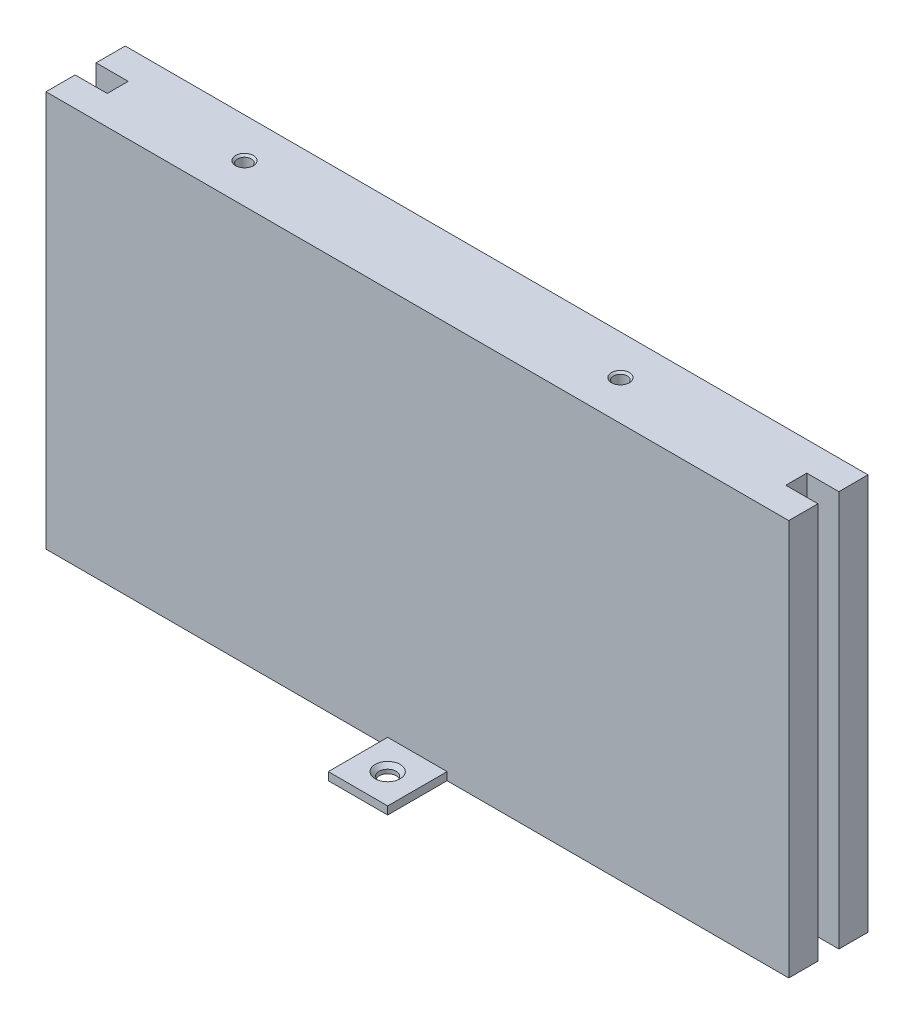
ISO-10303-21;
HEADER;
FILE_DESCRIPTION(('STEP AP214'),'2;1');
FILE_NAME('part.step','',(''),(''),'','','');
FILE_SCHEMA(('AUTOMOTIVE_DESIGN { 1 0 10303 214 1 1 1 1 }'));
ENDSEC;
DATA;
#1=APPLICATION_CONTEXT('core data for automotive mechanical design processes');
#2=APPLICATION_PROTOCOL_DEFINITION('international standard','automotive_design',2000,#1);
#3=PRODUCT_CONTEXT('',#1,'mechanical');
#4=PRODUCT('Part','Part','',(#3));
#5=PRODUCT_RELATED_PRODUCT_CATEGORY('part','',(#4));
#6=PRODUCT_DEFINITION_FORMATION('','',#4);
#7=PRODUCT_DEFINITION_CONTEXT('part definition',#1,'design');
#8=PRODUCT_DEFINITION('design','',#6,#7);
#9=PRODUCT_DEFINITION_SHAPE('','',#8);
#10=(LENGTH_UNIT() NAMED_UNIT(*) SI_UNIT(.MILLI.,.METRE.));
#11=(NAMED_UNIT(*) PLANE_ANGLE_UNIT() SI_UNIT($,.RADIAN.));
#12=(NAMED_UNIT(*) SI_UNIT($,.STERADIAN.) SOLID_ANGLE_UNIT());
#13=UNCERTAINTY_MEASURE_WITH_UNIT(LENGTH_MEASURE(1.E-05),#10,'distance_accuracy_value','');
#14=(GEOMETRIC_REPRESENTATION_CONTEXT(3) GLOBAL_UNCERTAINTY_ASSIGNED_CONTEXT((#13)) GLOBAL_UNIT_ASSIGNED_CONTEXT((#10,
#11,#12)) REPRESENTATION_CONTEXT('',''));
#15=CARTESIAN_POINT('',(0.,0.,0.));
#16=DIRECTION('',(0.,0.,1.));
#17=DIRECTION('',(1.,0.,0.));
#18=AXIS2_PLACEMENT_3D('',#15,#16,#17);
#19=CARTESIAN_POINT('',(187.5,100.,0.));
#20=DIRECTION('',(0.,0.,-1.));
#21=DIRECTION('',(-1.,0.,0.));
#22=AXIS2_PLACEMENT_3D('',#19,#20,#21);
#23=PLANE('',#22);
#24=DIRECTION('',(0.,-1.,0.));
#25=VECTOR('',#24,1.);
#26=CARTESIAN_POINT('',(86.25,0.,0.));
#27=LINE('',#26,#25);
#28=CARTESIAN_POINT('',(86.25,2.,0.));
#29=VERTEX_POINT('',#28);
#30=CARTESIAN_POINT('',(86.25,0.,0.));
#31=VERTEX_POINT('',#30);
#32=EDGE_CURVE('E64',#29,#31,#27,.T.);
#33=ORIENTED_EDGE('',*,*,#32,.F.);
#34=DIRECTION('',(-1.,0.,0.));
#35=VECTOR('',#34,1.);
#36=CARTESIAN_POINT('',(86.25,2.,0.));
#37=LINE('',#36,#35);
#38=CARTESIAN_POINT('',(101.25,2.,0.));
#39=VERTEX_POINT('',#38);
#40=EDGE_CURVE('E569',#39,#29,#37,.T.);
#41=ORIENTED_EDGE('',*,*,#40,.F.);
#42=DIRECTION('',(0.,1.,0.));
#43=VECTOR('',#42,1.);
#44=CARTESIAN_POINT('',(101.25,2.,0.));
#45=LINE('',#44,#43);
#46=CARTESIAN_POINT('',(101.25,0.,0.));
#47=VERTEX_POINT('',#46);
#48=EDGE_CURVE('E70',#47,#39,#45,.T.);
#49=ORIENTED_EDGE('',*,*,#48,.F.);
#50=DIRECTION('',(1.,0.,0.));
#51=VECTOR('',#50,1.);
#52=CARTESIAN_POINT('',(187.5,0.,0.));
#53=LINE('',#52,#51);
#54=CARTESIAN_POINT('',(187.5,0.,0.));
#55=VERTEX_POINT('',#54);
#56=EDGE_CURVE('E210',#47,#55,#53,.T.);
#57=ORIENTED_EDGE('',*,*,#56,.T.);
#58=DIRECTION('',(0.,-1.,0.));
#59=VECTOR('',#58,1.);
#60=CARTESIAN_POINT('',(187.5,100.,0.));
#61=LINE('',#60,#59);
#62=CARTESIAN_POINT('',(187.5,100.,0.));
#63=VERTEX_POINT('',#62);
#64=EDGE_CURVE('E384',#63,#55,#61,.T.);
#65=ORIENTED_EDGE('',*,*,#64,.F.);
#66=DIRECTION('',(1.,0.,0.));
#67=VECTOR('',#66,1.);
#68=CARTESIAN_POINT('',(187.5,100.,0.));
#69=LINE('',#68,#67);
#70=CARTESIAN_POINT('',(0.,100.,0.));
#71=VERTEX_POINT('',#70);
#72=EDGE_CURVE('E338',#71,#63,#69,.T.);
#73=ORIENTED_EDGE('',*,*,#72,.F.);
#74=DIRECTION('',(0.,-1.,0.));
#75=VECTOR('',#74,1.);
#76=CARTESIAN_POINT('',(0.,100.,0.));
#77=LINE('',#76,#75);
#78=CARTESIAN_POINT('',(0.,0.,0.));
#79=VERTEX_POINT('',#78);
#80=EDGE_CURVE('E356',#71,#79,#77,.T.);
#81=ORIENTED_EDGE('',*,*,#80,.T.);
#82=EDGE_CURVE('E357',#79,#31,#53,.T.);
#83=ORIENTED_EDGE('',*,*,#82,.T.);
#84=EDGE_LOOP('',(#33,#41,#49,#57,#65,#73,#81,#83));
#85=FACE_BOUND('',#84,.T.);
#86=ADVANCED_FACE('F47',(#85),#23,.F.);
#87=CARTESIAN_POINT('',(0.,100.,-20.));
#88=DIRECTION('',(0.,0.,1.));
#89=DIRECTION('',(1.,0.,0.));
#90=AXIS2_PLACEMENT_3D('',#87,#88,#89);
#91=PLANE('',#90);
#92=DIRECTION('',(0.,-1.,0.));
#93=VECTOR('',#92,1.);
#94=CARTESIAN_POINT('',(101.25,2.00000000000004,-20.));
#95=LINE('',#94,#93);
#96=CARTESIAN_POINT('',(101.25,2.00000000000004,-20.));
#97=VERTEX_POINT('',#96);
#98=CARTESIAN_POINT('',(101.25,0.,-20.));
#99=VERTEX_POINT('',#98);
#100=EDGE_CURVE('E212',#97,#99,#95,.T.);
#101=ORIENTED_EDGE('',*,*,#100,.F.);
#102=DIRECTION('',(1.,0.,0.));
#103=VECTOR('',#102,1.);
#104=CARTESIAN_POINT('',(101.25,2.00000000000004,-20.));
#105=LINE('',#104,#103);
#106=CARTESIAN_POINT('',(86.25,2.00000000000004,-20.));
#107=VERTEX_POINT('',#106);
#108=EDGE_CURVE('E228',#107,#97,#105,.T.);
#109=ORIENTED_EDGE('',*,*,#108,.F.);
#110=DIRECTION('',(0.,1.,0.));
#111=VECTOR('',#110,1.);
#112=CARTESIAN_POINT('',(86.25,2.00000000000004,-20.));
#113=LINE('',#112,#111);
#114=CARTESIAN_POINT('',(86.25,0.,-20.));
#115=VERTEX_POINT('',#114);
#116=EDGE_CURVE('E217',#115,#107,#113,.T.);
#117=ORIENTED_EDGE('',*,*,#116,.F.);
#118=DIRECTION('',(-1.,0.,0.));
#119=VECTOR('',#118,1.);
#120=CARTESIAN_POINT('',(0.,0.,-20.));
#121=LINE('',#120,#119);
#122=CARTESIAN_POINT('',(0.,0.,-20.));
#123=VERTEX_POINT('',#122);
#124=EDGE_CURVE('E365',#115,#123,#121,.T.);
#125=ORIENTED_EDGE('',*,*,#124,.T.);
#126=DIRECTION('',(0.,-1.,0.));
#127=VECTOR('',#126,1.);
#128=CARTESIAN_POINT('',(0.,100.,-20.));
#129=LINE('',#128,#127);
#130=CARTESIAN_POINT('',(0.,100.,-20.));
#131=VERTEX_POINT('',#130);
#132=EDGE_CURVE('E376',#131,#123,#129,.T.);
#133=ORIENTED_EDGE('',*,*,#132,.F.);
#134=DIRECTION('',(-1.,0.,0.));
#135=VECTOR('',#134,1.);
#136=CARTESIAN_POINT('',(0.,100.,-20.));
#137=LINE('',#136,#135);
#138=CARTESIAN_POINT('',(187.5,100.,-20.));
#139=VERTEX_POINT('',#138);
#140=EDGE_CURVE('E348',#139,#131,#137,.T.);
#141=ORIENTED_EDGE('',*,*,#140,.F.);
#142=DIRECTION('',(0.,-1.,0.));
#143=VECTOR('',#142,1.);
#144=CARTESIAN_POINT('',(187.5,100.,-20.));
#145=LINE('',#144,#143);
#146=CARTESIAN_POINT('',(187.5,0.,-20.));
#147=VERTEX_POINT('',#146);
#148=EDGE_CURVE('E380',#139,#147,#145,.T.);
#149=ORIENTED_EDGE('',*,*,#148,.T.);
#150=EDGE_CURVE('E366',#147,#99,#121,.T.);
#151=ORIENTED_EDGE('',*,*,#150,.T.);
#152=EDGE_LOOP('',(#101,#109,#117,#125,#133,#141,#149,#151));
#153=FACE_BOUND('',#152,.T.);
#154=ADVANCED_FACE('F427',(#153),#91,.F.);
#155=CARTESIAN_POINT('',(187.5,100.,-20.));
#156=DIRECTION('',(-1.,0.,0.));
#157=DIRECTION('',(0.,0.,1.));
#158=AXIS2_PLACEMENT_3D('',#155,#156,#157);
#159=PLANE('',#158);
#160=DIRECTION('',(0.,0.,-1.));
#161=VECTOR('',#160,1.);
#162=CARTESIAN_POINT('',(187.5,0.,-20.));
#163=LINE('',#162,#161);
#164=CARTESIAN_POINT('',(187.5,0.,-7.35));
#165=VERTEX_POINT('',#164);
#166=EDGE_CURVE('E361',#55,#165,#163,.T.);
#167=ORIENTED_EDGE('',*,*,#166,.T.);
#168=DIRECTION('',(0.,1.,0.));
#169=VECTOR('',#168,1.);
#170=CARTESIAN_POINT('',(187.5,0.,-7.35));
#171=LINE('',#170,#169);
#172=CARTESIAN_POINT('',(187.5,100.,-7.35));
#173=VERTEX_POINT('',#172);
#174=EDGE_CURVE('E264',#165,#173,#171,.T.);
#175=ORIENTED_EDGE('',*,*,#174,.T.);
#176=DIRECTION('',(0.,0.,-1.));
#177=VECTOR('',#176,1.);
#178=CARTESIAN_POINT('',(187.5,100.,-20.));
#179=LINE('',#178,#177);
#180=EDGE_CURVE('E344',#63,#173,#179,.T.);
#181=ORIENTED_EDGE('',*,*,#180,.F.);
#182=ORIENTED_EDGE('',*,*,#64,.T.);
#183=EDGE_LOOP('',(#167,#175,#181,#182));
#184=FACE_BOUND('',#183,.T.);
#185=ADVANCED_FACE('F434',(#184),#159,.F.);
#186=CARTESIAN_POINT('',(0.,100.,0.));
#187=DIRECTION('',(1.,0.,0.));
#188=DIRECTION('',(0.,0.,-1.));
#189=AXIS2_PLACEMENT_3D('',#186,#187,#188);
#190=PLANE('',#189);
#191=DIRECTION('',(0.,0.,1.));
#192=VECTOR('',#191,1.);
#193=CARTESIAN_POINT('',(0.,0.,0.));
#194=LINE('',#193,#192);
#195=CARTESIAN_POINT('',(0.,0.,-12.65));
#196=VERTEX_POINT('',#195);
#197=EDGE_CURVE('E343',#123,#196,#194,.T.);
#198=ORIENTED_EDGE('',*,*,#197,.T.);
#199=DIRECTION('',(0.,1.,0.));
#200=VECTOR('',#199,1.);
#201=CARTESIAN_POINT('',(0.,0.,-12.65));
#202=LINE('',#201,#200);
#203=CARTESIAN_POINT('',(0.,100.,-12.65));
#204=VERTEX_POINT('',#203);
#205=EDGE_CURVE('E292',#196,#204,#202,.T.);
#206=ORIENTED_EDGE('',*,*,#205,.T.);
#207=DIRECTION('',(0.,0.,1.));
#208=VECTOR('',#207,1.);
#209=CARTESIAN_POINT('',(0.,100.,0.));
#210=LINE('',#209,#208);
#211=EDGE_CURVE('E352',#131,#204,#210,.T.);
#212=ORIENTED_EDGE('',*,*,#211,.F.);
#213=ORIENTED_EDGE('',*,*,#132,.T.);
#214=EDGE_LOOP('',(#198,#206,#212,#213));
#215=FACE_BOUND('',#214,.T.);
#216=ADVANCED_FACE('F521',(#215),#190,.F.);
#217=CARTESIAN_POINT('',(187.5,100.,-12.65));
#218=VERTEX_POINT('',#217);
#219=EDGE_CURVE('E342',#218,#139,#179,.T.);
#220=ORIENTED_EDGE('',*,*,#219,.F.);
#221=DIRECTION('',(0.,1.,0.));
#222=VECTOR('',#221,1.);
#223=CARTESIAN_POINT('',(187.5,0.,-12.65));
#224=LINE('',#223,#222);
#225=CARTESIAN_POINT('',(187.5,0.,-12.65));
#226=VERTEX_POINT('',#225);
#227=EDGE_CURVE('E304',#226,#218,#224,.T.);
#228=ORIENTED_EDGE('',*,*,#227,.F.);
#229=EDGE_CURVE('E360',#226,#147,#163,.T.);
#230=ORIENTED_EDGE('',*,*,#229,.T.);
#231=ORIENTED_EDGE('',*,*,#148,.F.);
#232=EDGE_LOOP('',(#220,#228,#230,#231));
#233=FACE_BOUND('',#232,.T.);
#234=ADVANCED_FACE('F439',(#233),#159,.F.);
#235=CARTESIAN_POINT('',(0.,100.,-7.35));
#236=VERTEX_POINT('',#235);
#237=EDGE_CURVE('E351',#236,#71,#210,.T.);
#238=ORIENTED_EDGE('',*,*,#237,.F.);
#239=DIRECTION('',(0.,1.,0.));
#240=VECTOR('',#239,1.);
#241=CARTESIAN_POINT('',(0.,0.,-7.35));
#242=LINE('',#241,#240);
#243=CARTESIAN_POINT('',(0.,0.,-7.35));
#244=VERTEX_POINT('',#243);
#245=EDGE_CURVE('E280',#244,#236,#242,.T.);
#246=ORIENTED_EDGE('',*,*,#245,.F.);
#247=EDGE_CURVE('E369',#244,#79,#194,.T.);
#248=ORIENTED_EDGE('',*,*,#247,.T.);
#249=ORIENTED_EDGE('',*,*,#80,.F.);
#250=EDGE_LOOP('',(#238,#246,#248,#249));
#251=FACE_BOUND('',#250,.T.);
#252=ADVANCED_FACE('F514',(#251),#190,.F.);
#253=CARTESIAN_POINT('',(0.,100.,0.));
#254=DIRECTION('',(0.,-1.,0.));
#255=DIRECTION('',(0.,0.,-1.));
#256=AXIS2_PLACEMENT_3D('',#253,#254,#255);
#257=PLANE('',#256);
#258=CARTESIAN_POINT('',(135.,100.,-9.99999999999999));
#259=DIRECTION('',(0.,-1.,0.));
#260=DIRECTION('',(0.,0.,-1.));
#261=AXIS2_PLACEMENT_3D('',#258,#259,#260);
#262=CIRCLE('',#261,2.25000000000006);
#263=CARTESIAN_POINT('',(135.,100.,-12.2500000000001));
#264=VERTEX_POINT('',#263);
#265=EDGE_CURVE('E400',#264,#264,#262,.T.);
#266=ORIENTED_EDGE('',*,*,#265,.T.);
#267=EDGE_LOOP('',(#266));
#268=FACE_BOUND('',#267,.T.);
#269=CARTESIAN_POINT('',(40.1,100.,-10.));
#270=DIRECTION('',(0.,-1.,0.));
#271=DIRECTION('',(0.,0.,-1.));
#272=AXIS2_PLACEMENT_3D('',#269,#270,#271);
#273=CIRCLE('',#272,2.25);
#274=CARTESIAN_POINT('',(40.1,100.,-12.25));
#275=VERTEX_POINT('',#274);
#276=EDGE_CURVE('E392',#275,#275,#273,.T.);
#277=ORIENTED_EDGE('',*,*,#276,.T.);
#278=EDGE_LOOP('',(#277));
#279=FACE_BOUND('',#278,.T.);
#280=ORIENTED_EDGE('',*,*,#211,.T.);
#281=DIRECTION('',(-1.,0.,0.));
#282=VECTOR('',#281,1.);
#283=CARTESIAN_POINT('',(0.,100.,-12.65));
#284=LINE('',#283,#282);
#285=CARTESIAN_POINT('',(8.1,100.,-12.65));
#286=VERTEX_POINT('',#285);
#287=EDGE_CURVE('E273',#286,#204,#284,.T.);
#288=ORIENTED_EDGE('',*,*,#287,.F.);
#289=DIRECTION('',(0.,0.,-1.));
#290=VECTOR('',#289,1.);
#291=CARTESIAN_POINT('',(8.1,100.,-12.65));
#292=LINE('',#291,#290);
#293=CARTESIAN_POINT('',(8.1,100.,-7.35));
#294=VERTEX_POINT('',#293);
#295=EDGE_CURVE('E285',#294,#286,#292,.T.);
#296=ORIENTED_EDGE('',*,*,#295,.F.);
#297=DIRECTION('',(1.,0.,0.));
#298=VECTOR('',#297,1.);
#299=CARTESIAN_POINT('',(0.,100.,-7.35));
#300=LINE('',#299,#298);
#301=EDGE_CURVE('E281',#236,#294,#300,.T.);
#302=ORIENTED_EDGE('',*,*,#301,.F.);
#303=ORIENTED_EDGE('',*,*,#237,.T.);
#304=ORIENTED_EDGE('',*,*,#72,.T.);
#305=ORIENTED_EDGE('',*,*,#180,.T.);
#306=DIRECTION('',(1.,0.,0.));
#307=VECTOR('',#306,1.);
#308=CARTESIAN_POINT('',(179.4,100.,-7.35));
#309=LINE('',#308,#307);
#310=CARTESIAN_POINT('',(179.4,100.,-7.35));
#311=VERTEX_POINT('',#310);
#312=EDGE_CURVE('E317',#311,#173,#309,.T.);
#313=ORIENTED_EDGE('',*,*,#312,.F.);
#314=DIRECTION('',(0.,0.,1.));
#315=VECTOR('',#314,1.);
#316=CARTESIAN_POINT('',(179.4,100.,-12.6500000000001));
#317=LINE('',#316,#315);
#318=CARTESIAN_POINT('',(179.4,100.,-12.6500000000001));
#319=VERTEX_POINT('',#318);
#320=EDGE_CURVE('E320',#319,#311,#317,.T.);
#321=ORIENTED_EDGE('',*,*,#320,.F.);
#322=DIRECTION('',(-1.,0.,0.));
#323=VECTOR('',#322,1.);
#324=CARTESIAN_POINT('',(187.5,100.,-12.65));
#325=LINE('',#324,#323);
#326=EDGE_CURVE('E286',#218,#319,#325,.T.);
#327=ORIENTED_EDGE('',*,*,#326,.F.);
#328=ORIENTED_EDGE('',*,*,#219,.T.);
#329=ORIENTED_EDGE('',*,*,#140,.T.);
#330=EDGE_LOOP('',(#280,#288,#296,#302,#303,#304,#305,#313,#321,#327,#328,#329));
#331=FACE_BOUND('',#330,.T.);
#332=ADVANCED_FACE('F511',(#268,#279,#331),#257,.F.);
#333=CARTESIAN_POINT('',(0.,0.,0.));
#334=DIRECTION('',(0.,-1.,0.));
#335=DIRECTION('',(0.,0.,-1.));
#336=AXIS2_PLACEMENT_3D('',#333,#334,#335);
#337=PLANE('',#336);
#338=CARTESIAN_POINT('',(93.75,0.,-27.5));
#339=DIRECTION('',(0.,-1.,0.));
#340=DIRECTION('',(0.,0.,-1.));
#341=AXIS2_PLACEMENT_3D('',#338,#339,#340);
#342=CIRCLE('',#341,2.15);
#343=CARTESIAN_POINT('',(93.75,0.,-29.65));
#344=VERTEX_POINT('',#343);
#345=EDGE_CURVE('E573',#344,#344,#342,.T.);
#346=ORIENTED_EDGE('',*,*,#345,.F.);
#347=EDGE_LOOP('',(#346));
#348=FACE_BOUND('',#347,.T.);
#349=CARTESIAN_POINT('',(93.75,0.,7.5));
#350=DIRECTION('',(0.,-1.,0.));
#351=DIRECTION('',(0.,0.,-1.));
#352=AXIS2_PLACEMENT_3D('',#349,#350,#351);
#353=CIRCLE('',#352,2.15);
#354=CARTESIAN_POINT('',(93.75,0.,5.35));
#355=VERTEX_POINT('',#354);
#356=EDGE_CURVE('E580',#355,#355,#353,.T.);
#357=ORIENTED_EDGE('',*,*,#356,.F.);
#358=EDGE_LOOP('',(#357));
#359=FACE_BOUND('',#358,.T.);
#360=DIRECTION('',(-1.,0.,0.));
#361=VECTOR('',#360,1.);
#362=CARTESIAN_POINT('',(0.,0.,-12.65));
#363=LINE('',#362,#361);
#364=CARTESIAN_POINT('',(8.1,0.,-12.65));
#365=VERTEX_POINT('',#364);
#366=EDGE_CURVE('E277',#365,#196,#363,.T.);
#367=ORIENTED_EDGE('',*,*,#366,.T.);
#368=ORIENTED_EDGE('',*,*,#197,.F.);
#369=ORIENTED_EDGE('',*,*,#124,.F.);
#370=DIRECTION('',(0.,0.,1.));
#371=VECTOR('',#370,1.);
#372=CARTESIAN_POINT('',(86.25,0.,-35.));
#373=LINE('',#372,#371);
#374=CARTESIAN_POINT('',(86.25,0.,-35.));
#375=VERTEX_POINT('',#374);
#376=EDGE_CURVE('E251',#375,#115,#373,.T.);
#377=ORIENTED_EDGE('',*,*,#376,.F.);
#378=DIRECTION('',(-1.,0.,0.));
#379=VECTOR('',#378,1.);
#380=CARTESIAN_POINT('',(101.25,0.,-35.));
#381=LINE('',#380,#379);
#382=CARTESIAN_POINT('',(101.25,0.,-35.));
#383=VERTEX_POINT('',#382);
#384=EDGE_CURVE('E227',#383,#375,#381,.T.);
#385=ORIENTED_EDGE('',*,*,#384,.F.);
#386=DIRECTION('',(0.,0.,1.));
#387=VECTOR('',#386,1.);
#388=CARTESIAN_POINT('',(101.25,0.,-35.));
#389=LINE('',#388,#387);
#390=EDGE_CURVE('E255',#383,#99,#389,.T.);
#391=ORIENTED_EDGE('',*,*,#390,.T.);
#392=ORIENTED_EDGE('',*,*,#150,.F.);
#393=ORIENTED_EDGE('',*,*,#229,.F.);
#394=DIRECTION('',(-1.,0.,0.));
#395=VECTOR('',#394,1.);
#396=CARTESIAN_POINT('',(187.5,0.,-12.65));
#397=LINE('',#396,#395);
#398=CARTESIAN_POINT('',(179.4,0.,-12.6500000000001));
#399=VERTEX_POINT('',#398);
#400=EDGE_CURVE('E321',#226,#399,#397,.T.);
#401=ORIENTED_EDGE('',*,*,#400,.T.);
#402=DIRECTION('',(0.,0.,1.));
#403=VECTOR('',#402,1.);
#404=CARTESIAN_POINT('',(179.4,0.,-12.6500000000001));
#405=LINE('',#404,#403);
#406=CARTESIAN_POINT('',(179.4,0.,-7.35));
#407=VERTEX_POINT('',#406);
#408=EDGE_CURVE('E331',#399,#407,#405,.T.);
#409=ORIENTED_EDGE('',*,*,#408,.T.);
#410=DIRECTION('',(1.,0.,0.));
#411=VECTOR('',#410,1.);
#412=CARTESIAN_POINT('',(179.4,0.,-7.35));
#413=LINE('',#412,#411);
#414=EDGE_CURVE('E307',#407,#165,#413,.T.);
#415=ORIENTED_EDGE('',*,*,#414,.T.);
#416=ORIENTED_EDGE('',*,*,#166,.F.);
#417=ORIENTED_EDGE('',*,*,#56,.F.);
#418=DIRECTION('',(0.,0.,-1.));
#419=VECTOR('',#418,1.);
#420=CARTESIAN_POINT('',(101.25,0.,15.));
#421=LINE('',#420,#419);
#422=CARTESIAN_POINT('',(101.25,0.,15.));
#423=VERTEX_POINT('',#422);
#424=EDGE_CURVE('E189',#423,#47,#421,.T.);
#425=ORIENTED_EDGE('',*,*,#424,.F.);
#426=DIRECTION('',(1.,0.,0.));
#427=VECTOR('',#426,1.);
#428=CARTESIAN_POINT('',(101.25,0.,15.));
#429=LINE('',#428,#427);
#430=CARTESIAN_POINT('',(86.25,0.,15.));
#431=VERTEX_POINT('',#430);
#432=EDGE_CURVE('E196',#431,#423,#429,.T.);
#433=ORIENTED_EDGE('',*,*,#432,.F.);
#434=DIRECTION('',(0.,0.,-1.));
#435=VECTOR('',#434,1.);
#436=CARTESIAN_POINT('',(86.25,0.,15.));
#437=LINE('',#436,#435);
#438=EDGE_CURVE('E558',#431,#31,#437,.T.);
#439=ORIENTED_EDGE('',*,*,#438,.T.);
#440=ORIENTED_EDGE('',*,*,#82,.F.);
#441=ORIENTED_EDGE('',*,*,#247,.F.);
#442=DIRECTION('',(1.,0.,0.));
#443=VECTOR('',#442,1.);
#444=CARTESIAN_POINT('',(0.,0.,-7.35));
#445=LINE('',#444,#443);
#446=CARTESIAN_POINT('',(8.1,0.,-7.35));
#447=VERTEX_POINT('',#446);
#448=EDGE_CURVE('E268',#244,#447,#445,.T.);
#449=ORIENTED_EDGE('',*,*,#448,.T.);
#450=DIRECTION('',(0.,0.,-1.));
#451=VECTOR('',#450,1.);
#452=CARTESIAN_POINT('',(8.1,0.,-12.65));
#453=LINE('',#452,#451);
#454=EDGE_CURVE('E272',#447,#365,#453,.T.);
#455=ORIENTED_EDGE('',*,*,#454,.T.);
#456=EDGE_LOOP('',(#367,#368,#369,#377,#385,#391,#392,#393,#401,#409,#415,#416,#417,#425,#433,
#439,#440,#441,#449,#455));
#457=FACE_BOUND('',#456,.T.);
#458=ADVANCED_FACE('F208',(#348,#359,#457),#337,.T.);
#459=CARTESIAN_POINT('',(179.4,0.,-7.35));
#460=DIRECTION('',(0.,0.,1.));
#461=DIRECTION('',(1.,0.,0.));
#462=AXIS2_PLACEMENT_3D('',#459,#460,#461);
#463=PLANE('',#462);
#464=ORIENTED_EDGE('',*,*,#312,.T.);
#465=ORIENTED_EDGE('',*,*,#174,.F.);
#466=ORIENTED_EDGE('',*,*,#414,.F.);
#467=DIRECTION('',(0.,1.,0.));
#468=VECTOR('',#467,1.);
#469=CARTESIAN_POINT('',(179.4,0.,-7.35));
#470=LINE('',#469,#468);
#471=EDGE_CURVE('E311',#407,#311,#470,.T.);
#472=ORIENTED_EDGE('',*,*,#471,.T.);
#473=EDGE_LOOP('',(#464,#465,#466,#472));
#474=FACE_BOUND('',#473,.T.);
#475=ADVANCED_FACE('F506',(#474),#463,.F.);
#476=CARTESIAN_POINT('',(179.4,0.,-12.6500000000001));
#477=DIRECTION('',(-1.,0.,0.));
#478=DIRECTION('',(0.,0.,1.));
#479=AXIS2_PLACEMENT_3D('',#476,#477,#478);
#480=PLANE('',#479);
#481=ORIENTED_EDGE('',*,*,#320,.T.);
#482=ORIENTED_EDGE('',*,*,#471,.F.);
#483=ORIENTED_EDGE('',*,*,#408,.F.);
#484=DIRECTION('',(0.,1.,0.));
#485=VECTOR('',#484,1.);
#486=CARTESIAN_POINT('',(179.4,0.,-12.6500000000001));
#487=LINE('',#486,#485);
#488=EDGE_CURVE('E308',#399,#319,#487,.T.);
#489=ORIENTED_EDGE('',*,*,#488,.T.);
#490=EDGE_LOOP('',(#481,#482,#483,#489));
#491=FACE_BOUND('',#490,.T.);
#492=ADVANCED_FACE('F502',(#491),#480,.F.);
#493=CARTESIAN_POINT('',(187.5,0.,-12.65));
#494=DIRECTION('',(0.,0.,-1.));
#495=DIRECTION('',(-1.,0.,0.));
#496=AXIS2_PLACEMENT_3D('',#493,#494,#495);
#497=PLANE('',#496);
#498=ORIENTED_EDGE('',*,*,#326,.T.);
#499=ORIENTED_EDGE('',*,*,#488,.F.);
#500=ORIENTED_EDGE('',*,*,#400,.F.);
#501=ORIENTED_EDGE('',*,*,#227,.T.);
#502=EDGE_LOOP('',(#498,#499,#500,#501));
#503=FACE_BOUND('',#502,.T.);
#504=ADVANCED_FACE('F493',(#503),#497,.F.);
#505=CARTESIAN_POINT('',(0.,0.,-12.65));
#506=DIRECTION('',(0.,0.,-1.));
#507=DIRECTION('',(-1.,0.,0.));
#508=AXIS2_PLACEMENT_3D('',#505,#506,#507);
#509=PLANE('',#508);
#510=ORIENTED_EDGE('',*,*,#287,.T.);
#511=ORIENTED_EDGE('',*,*,#205,.F.);
#512=ORIENTED_EDGE('',*,*,#366,.F.);
#513=DIRECTION('',(0.,1.,0.));
#514=VECTOR('',#513,1.);
#515=CARTESIAN_POINT('',(8.1,0.,-12.65));
#516=LINE('',#515,#514);
#517=EDGE_CURVE('E296',#365,#286,#516,.T.);
#518=ORIENTED_EDGE('',*,*,#517,.T.);
#519=EDGE_LOOP('',(#510,#511,#512,#518));
#520=FACE_BOUND('',#519,.T.);
#521=ADVANCED_FACE('F489',(#520),#509,.F.);
#522=CARTESIAN_POINT('',(8.1,0.,-12.65));
#523=DIRECTION('',(1.,0.,0.));
#524=DIRECTION('',(0.,0.,-1.));
#525=AXIS2_PLACEMENT_3D('',#522,#523,#524);
#526=PLANE('',#525);
#527=ORIENTED_EDGE('',*,*,#295,.T.);
#528=ORIENTED_EDGE('',*,*,#517,.F.);
#529=ORIENTED_EDGE('',*,*,#454,.F.);
#530=DIRECTION('',(0.,1.,0.));
#531=VECTOR('',#530,1.);
#532=CARTESIAN_POINT('',(8.1,0.,-7.35));
#533=LINE('',#532,#531);
#534=EDGE_CURVE('E299',#447,#294,#533,.T.);
#535=ORIENTED_EDGE('',*,*,#534,.T.);
#536=EDGE_LOOP('',(#527,#528,#529,#535));
#537=FACE_BOUND('',#536,.T.);
#538=ADVANCED_FACE('F492',(#537),#526,.F.);
#539=CARTESIAN_POINT('',(0.,0.,-7.35));
#540=DIRECTION('',(0.,0.,1.));
#541=DIRECTION('',(1.,0.,0.));
#542=AXIS2_PLACEMENT_3D('',#539,#540,#541);
#543=PLANE('',#542);
#544=ORIENTED_EDGE('',*,*,#301,.T.);
#545=ORIENTED_EDGE('',*,*,#534,.F.);
#546=ORIENTED_EDGE('',*,*,#448,.F.);
#547=ORIENTED_EDGE('',*,*,#245,.T.);
#548=EDGE_LOOP('',(#544,#545,#546,#547));
#549=FACE_BOUND('',#548,.T.);
#550=ADVANCED_FACE('F474',(#549),#543,.F.);
#551=CARTESIAN_POINT('',(135.,92.,-9.99999999999999));
#552=DIRECTION('',(0.,1.,0.));
#553=DIRECTION('',(0.,0.,1.));
#554=AXIS2_PLACEMENT_3D('',#551,#552,#553);
#555=CYLINDRICAL_SURFACE('',#554,1.75000000000001);
#556=CARTESIAN_POINT('',(135.,99.5,-9.99999999999999));
#557=DIRECTION('',(0.,-1.,0.));
#558=DIRECTION('',(0.,0.,-1.));
#559=AXIS2_PLACEMENT_3D('',#556,#557,#558);
#560=CIRCLE('',#559,1.75000000000001);
#561=CARTESIAN_POINT('',(135.,99.5,-11.75));
#562=VERTEX_POINT('',#561);
#563=EDGE_CURVE('E396',#562,#562,#560,.F.);
#564=ORIENTED_EDGE('',*,*,#563,.T.);
#565=EDGE_LOOP('',(#564));
#566=FACE_BOUND('',#565,.T.);
#567=CARTESIAN_POINT('',(135.,92.,-9.99999999999999));
#568=DIRECTION('',(0.,1.,0.));
#569=DIRECTION('',(0.,0.,1.));
#570=AXIS2_PLACEMENT_3D('',#567,#568,#569);
#571=CIRCLE('',#570,1.75000000000001);
#572=CARTESIAN_POINT('',(135.,92.,-8.24999999999998));
#573=VERTEX_POINT('',#572);
#574=EDGE_CURVE('E259',#573,#573,#571,.T.);
#575=ORIENTED_EDGE('',*,*,#574,.F.);
#576=EDGE_LOOP('',(#575));
#577=FACE_BOUND('',#576,.T.);
#578=ADVANCED_FACE('F471',(#566,#577),#555,.F.);
#579=CARTESIAN_POINT('',(135.,92.,-9.99999999999999));
#580=DIRECTION('',(0.,1.,0.));
#581=DIRECTION('',(0.,0.,1.));
#582=AXIS2_PLACEMENT_3D('',#579,#580,#581);
#583=PLANE('',#582);
#584=ORIENTED_EDGE('',*,*,#574,.T.);
#585=EDGE_LOOP('',(#584));
#586=FACE_BOUND('',#585,.T.);
#587=ADVANCED_FACE('F473',(#586),#583,.T.);
#588=CARTESIAN_POINT('',(40.1,92.,-10.));
#589=DIRECTION('',(0.,1.,0.));
#590=DIRECTION('',(0.,0.,1.));
#591=AXIS2_PLACEMENT_3D('',#588,#589,#590);
#592=CYLINDRICAL_SURFACE('',#591,1.75);
#593=CARTESIAN_POINT('',(40.1,99.5,-10.));
#594=DIRECTION('',(0.,-1.,0.));
#595=DIRECTION('',(0.,0.,-1.));
#596=AXIS2_PLACEMENT_3D('',#593,#594,#595);
#597=CIRCLE('',#596,1.75);
#598=CARTESIAN_POINT('',(40.1,99.5,-11.75));
#599=VERTEX_POINT('',#598);
#600=EDGE_CURVE('E388',#599,#599,#597,.F.);
#601=ORIENTED_EDGE('',*,*,#600,.T.);
#602=EDGE_LOOP('',(#601));
#603=FACE_BOUND('',#602,.T.);
#604=CARTESIAN_POINT('',(40.1,92.,-10.));
#605=DIRECTION('',(0.,1.,0.));
#606=DIRECTION('',(0.,0.,1.));
#607=AXIS2_PLACEMENT_3D('',#604,#605,#606);
#608=CIRCLE('',#607,1.75);
#609=CARTESIAN_POINT('',(40.1,92.,-8.25));
#610=VERTEX_POINT('',#609);
#611=EDGE_CURVE('E260',#610,#610,#608,.T.);
#612=ORIENTED_EDGE('',*,*,#611,.F.);
#613=EDGE_LOOP('',(#612));
#614=FACE_BOUND('',#613,.T.);
#615=ADVANCED_FACE('F479',(#603,#614),#592,.F.);
#616=CARTESIAN_POINT('',(40.1,92.,-10.));
#617=DIRECTION('',(0.,1.,0.));
#618=DIRECTION('',(0.,0.,1.));
#619=AXIS2_PLACEMENT_3D('',#616,#617,#618);
#620=PLANE('',#619);
#621=ORIENTED_EDGE('',*,*,#611,.T.);
#622=EDGE_LOOP('',(#621));
#623=FACE_BOUND('',#622,.T.);
#624=ADVANCED_FACE('F448',(#623),#620,.T.);
#625=CARTESIAN_POINT('',(40.1,99.5,-10.));
#626=DIRECTION('',(0.,1.,0.));
#627=DIRECTION('',(0.,0.,1.));
#628=AXIS2_PLACEMENT_3D('',#625,#626,#627);
#629=CONICAL_SURFACE('',#628,1.75,0.78539816339746);
#630=ORIENTED_EDGE('',*,*,#276,.F.);
#631=EDGE_LOOP('',(#630));
#632=FACE_BOUND('',#631,.T.);
#633=ORIENTED_EDGE('',*,*,#600,.F.);
#634=EDGE_LOOP('',(#633));
#635=FACE_BOUND('',#634,.T.);
#636=ADVANCED_FACE('F441',(#632,#635),#629,.F.);
#637=CARTESIAN_POINT('',(135.,99.5,-9.99999999999999));
#638=DIRECTION('',(0.,1.,0.));
#639=DIRECTION('',(0.,0.,1.));
#640=AXIS2_PLACEMENT_3D('',#637,#638,#639);
#641=CONICAL_SURFACE('',#640,1.75000000000001,0.785398163397454);
#642=ORIENTED_EDGE('',*,*,#265,.F.);
#643=EDGE_LOOP('',(#642));
#644=FACE_BOUND('',#643,.T.);
#645=ORIENTED_EDGE('',*,*,#563,.F.);
#646=EDGE_LOOP('',(#645));
#647=FACE_BOUND('',#646,.T.);
#648=ADVANCED_FACE('F447',(#644,#647),#641,.F.);
#649=CARTESIAN_POINT('',(101.25,2.00000000000004,-35.));
#650=DIRECTION('',(-1.,0.,0.));
#651=DIRECTION('',(0.,0.,1.));
#652=AXIS2_PLACEMENT_3D('',#649,#650,#651);
#653=PLANE('',#652);
#654=ORIENTED_EDGE('',*,*,#100,.T.);
#655=ORIENTED_EDGE('',*,*,#390,.F.);
#656=DIRECTION('',(0.,-1.,0.));
#657=VECTOR('',#656,1.);
#658=CARTESIAN_POINT('',(101.25,2.00000000000004,-35.));
#659=LINE('',#658,#657);
#660=CARTESIAN_POINT('',(101.25,2.00000000000004,-35.));
#661=VERTEX_POINT('',#660);
#662=EDGE_CURVE('E223',#661,#383,#659,.T.);
#663=ORIENTED_EDGE('',*,*,#662,.F.);
#664=DIRECTION('',(0.,0.,1.));
#665=VECTOR('',#664,1.);
#666=CARTESIAN_POINT('',(101.25,2.00000000000004,-35.));
#667=LINE('',#666,#665);
#668=EDGE_CURVE('E236',#661,#97,#667,.T.);
#669=ORIENTED_EDGE('',*,*,#668,.T.);
#670=EDGE_LOOP('',(#654,#655,#663,#669));
#671=FACE_BOUND('',#670,.T.);
#672=ADVANCED_FACE('F454',(#671),#653,.F.);
#673=CARTESIAN_POINT('',(86.25,2.00000000000004,-35.));
#674=DIRECTION('',(1.,0.,0.));
#675=DIRECTION('',(0.,0.,-1.));
#676=AXIS2_PLACEMENT_3D('',#673,#674,#675);
#677=PLANE('',#676);
#678=ORIENTED_EDGE('',*,*,#116,.T.);
#679=DIRECTION('',(0.,0.,1.));
#680=VECTOR('',#679,1.);
#681=CARTESIAN_POINT('',(86.25,2.00000000000004,-35.));
#682=LINE('',#681,#680);
#683=CARTESIAN_POINT('',(86.25,2.00000000000004,-35.));
#684=VERTEX_POINT('',#683);
#685=EDGE_CURVE('E247',#684,#107,#682,.T.);
#686=ORIENTED_EDGE('',*,*,#685,.F.);
#687=DIRECTION('',(0.,1.,0.));
#688=VECTOR('',#687,1.);
#689=CARTESIAN_POINT('',(86.25,2.00000000000004,-35.));
#690=LINE('',#689,#688);
#691=EDGE_CURVE('E231',#375,#684,#690,.T.);
#692=ORIENTED_EDGE('',*,*,#691,.F.);
#693=ORIENTED_EDGE('',*,*,#376,.T.);
#694=EDGE_LOOP('',(#678,#686,#692,#693));
#695=FACE_BOUND('',#694,.T.);
#696=ADVANCED_FACE('F464',(#695),#677,.F.);
#697=CARTESIAN_POINT('',(101.25,2.00000000000004,-35.));
#698=DIRECTION('',(0.,-1.,0.));
#699=DIRECTION('',(1.,0.,0.));
#700=AXIS2_PLACEMENT_3D('',#697,#698,#699);
#701=PLANE('',#700);
#702=CARTESIAN_POINT('',(93.75,2.00000000000004,-27.5));
#703=DIRECTION('',(0.,-1.,0.));
#704=DIRECTION('',(1.,0.,0.));
#705=AXIS2_PLACEMENT_3D('',#702,#703,#704);
#706=CIRCLE('',#705,3.14999999999993);
#707=CARTESIAN_POINT('',(96.8999999999999,2.00000000000004,-27.5));
#708=VERTEX_POINT('',#707);
#709=EDGE_CURVE('E11',#708,#708,#706,.T.);
#710=ORIENTED_EDGE('',*,*,#709,.T.);
#711=EDGE_LOOP('',(#710));
#712=FACE_BOUND('',#711,.T.);
#713=ORIENTED_EDGE('',*,*,#108,.T.);
#714=ORIENTED_EDGE('',*,*,#668,.F.);
#715=DIRECTION('',(1.,0.,0.));
#716=VECTOR('',#715,1.);
#717=CARTESIAN_POINT('',(101.25,2.00000000000004,-35.));
#718=LINE('',#717,#716);
#719=EDGE_CURVE('E234',#684,#661,#718,.T.);
#720=ORIENTED_EDGE('',*,*,#719,.F.);
#721=ORIENTED_EDGE('',*,*,#685,.T.);
#722=EDGE_LOOP('',(#713,#714,#720,#721));
#723=FACE_BOUND('',#722,.T.);
#724=ADVANCED_FACE('F607',(#712,#723),#701,.F.);
#725=CARTESIAN_POINT('',(0.,0.,-35.));
#726=DIRECTION('',(0.,0.,-1.));
#727=DIRECTION('',(-1.,0.,0.));
#728=AXIS2_PLACEMENT_3D('',#725,#726,#727);
#729=PLANE('',#728);
#730=ORIENTED_EDGE('',*,*,#662,.T.);
#731=ORIENTED_EDGE('',*,*,#384,.T.);
#732=ORIENTED_EDGE('',*,*,#691,.T.);
#733=ORIENTED_EDGE('',*,*,#719,.T.);
#734=EDGE_LOOP('',(#730,#731,#732,#733));
#735=FACE_BOUND('',#734,.T.);
#736=ADVANCED_FACE('F605',(#735),#729,.T.);
#737=CARTESIAN_POINT('',(101.25,2.,15.));
#738=DIRECTION('',(-1.,0.,0.));
#739=DIRECTION('',(0.,0.,1.));
#740=AXIS2_PLACEMENT_3D('',#737,#738,#739);
#741=PLANE('',#740);
#742=ORIENTED_EDGE('',*,*,#48,.T.);
#743=DIRECTION('',(0.,0.,-1.));
#744=VECTOR('',#743,1.);
#745=CARTESIAN_POINT('',(101.25,2.,15.));
#746=LINE('',#745,#744);
#747=CARTESIAN_POINT('',(101.25,2.,15.));
#748=VERTEX_POINT('',#747);
#749=EDGE_CURVE('E191',#748,#39,#746,.T.);
#750=ORIENTED_EDGE('',*,*,#749,.F.);
#751=DIRECTION('',(0.,1.,0.));
#752=VECTOR('',#751,1.);
#753=CARTESIAN_POINT('',(101.25,2.,15.));
#754=LINE('',#753,#752);
#755=EDGE_CURVE('E185',#423,#748,#754,.T.);
#756=ORIENTED_EDGE('',*,*,#755,.F.);
#757=ORIENTED_EDGE('',*,*,#424,.T.);
#758=EDGE_LOOP('',(#742,#750,#756,#757));
#759=FACE_BOUND('',#758,.T.);
#760=ADVANCED_FACE('F187',(#759),#741,.F.);
#761=CARTESIAN_POINT('',(86.25,2.,15.));
#762=DIRECTION('',(0.,-1.,0.));
#763=DIRECTION('',(0.,0.,-1.));
#764=AXIS2_PLACEMENT_3D('',#761,#762,#763);
#765=PLANE('',#764);
#766=CARTESIAN_POINT('',(93.75,2.,7.5));
#767=DIRECTION('',(0.,-1.,0.));
#768=DIRECTION('',(0.,0.,-1.));
#769=AXIS2_PLACEMENT_3D('',#766,#767,#768);
#770=CIRCLE('',#769,3.14999999999999);
#771=CARTESIAN_POINT('',(93.75,2.,4.35000000000001));
#772=VERTEX_POINT('',#771);
#773=EDGE_CURVE('E408',#772,#772,#770,.T.);
#774=ORIENTED_EDGE('',*,*,#773,.T.);
#775=EDGE_LOOP('',(#774));
#776=FACE_BOUND('',#775,.T.);
#777=ORIENTED_EDGE('',*,*,#40,.T.);
#778=DIRECTION('',(0.,0.,-1.));
#779=VECTOR('',#778,1.);
#780=CARTESIAN_POINT('',(86.25,2.,15.));
#781=LINE('',#780,#779);
#782=CARTESIAN_POINT('',(86.25,2.,15.));
#783=VERTEX_POINT('',#782);
#784=EDGE_CURVE('E219',#783,#29,#781,.T.);
#785=ORIENTED_EDGE('',*,*,#784,.F.);
#786=DIRECTION('',(-1.,0.,0.));
#787=VECTOR('',#786,1.);
#788=CARTESIAN_POINT('',(86.25,2.,15.));
#789=LINE('',#788,#787);
#790=EDGE_CURVE('E195',#748,#783,#789,.T.);
#791=ORIENTED_EDGE('',*,*,#790,.F.);
#792=ORIENTED_EDGE('',*,*,#749,.T.);
#793=EDGE_LOOP('',(#777,#785,#791,#792));
#794=FACE_BOUND('',#793,.T.);
#795=ADVANCED_FACE('F601',(#776,#794),#765,.F.);
#796=CARTESIAN_POINT('',(86.25,0.,15.));
#797=DIRECTION('',(1.,0.,0.));
#798=DIRECTION('',(0.,0.,-1.));
#799=AXIS2_PLACEMENT_3D('',#796,#797,#798);
#800=PLANE('',#799);
#801=ORIENTED_EDGE('',*,*,#32,.T.);
#802=ORIENTED_EDGE('',*,*,#438,.F.);
#803=DIRECTION('',(0.,-1.,0.));
#804=VECTOR('',#803,1.);
#805=CARTESIAN_POINT('',(86.25,0.,15.));
#806=LINE('',#805,#804);
#807=EDGE_CURVE('E201',#783,#431,#806,.T.);
#808=ORIENTED_EDGE('',*,*,#807,.F.);
#809=ORIENTED_EDGE('',*,*,#784,.T.);
#810=EDGE_LOOP('',(#801,#802,#808,#809));
#811=FACE_BOUND('',#810,.T.);
#812=ADVANCED_FACE('F596',(#811),#800,.F.);
#813=CARTESIAN_POINT('',(0.,0.,15.));
#814=DIRECTION('',(0.,0.,-1.));
#815=DIRECTION('',(-1.,0.,0.));
#816=AXIS2_PLACEMENT_3D('',#813,#814,#815);
#817=PLANE('',#816);
#818=ORIENTED_EDGE('',*,*,#432,.T.);
#819=ORIENTED_EDGE('',*,*,#755,.T.);
#820=ORIENTED_EDGE('',*,*,#790,.T.);
#821=ORIENTED_EDGE('',*,*,#807,.T.);
#822=EDGE_LOOP('',(#818,#819,#820,#821));
#823=FACE_BOUND('',#822,.T.);
#824=ADVANCED_FACE('F199',(#823),#817,.F.);
#825=CARTESIAN_POINT('',(93.75,-13.,7.5));
#826=DIRECTION('',(0.,1.,0.));
#827=DIRECTION('',(-1.,0.,0.));
#828=AXIS2_PLACEMENT_3D('',#825,#826,#827);
#829=CYLINDRICAL_SURFACE('',#828,2.15);
#830=CARTESIAN_POINT('',(93.75,1.,7.5));
#831=DIRECTION('',(0.,-1.,0.));
#832=DIRECTION('',(0.,0.,-1.));
#833=AXIS2_PLACEMENT_3D('',#830,#831,#832);
#834=CIRCLE('',#833,2.15);
#835=CARTESIAN_POINT('',(93.75,1.,5.35));
#836=VERTEX_POINT('',#835);
#837=EDGE_CURVE('E404',#836,#836,#834,.F.);
#838=ORIENTED_EDGE('',*,*,#837,.T.);
#839=EDGE_LOOP('',(#838));
#840=FACE_BOUND('',#839,.T.);
#841=ORIENTED_EDGE('',*,*,#356,.T.);
#842=EDGE_LOOP('',(#841));
#843=FACE_BOUND('',#842,.T.);
#844=ADVANCED_FACE('F585',(#840,#843),#829,.F.);
#845=CARTESIAN_POINT('',(93.75,-13.,-27.5));
#846=DIRECTION('',(0.,1.,0.));
#847=DIRECTION('',(-1.,0.,0.));
#848=AXIS2_PLACEMENT_3D('',#845,#846,#847);
#849=CYLINDRICAL_SURFACE('',#848,2.15);
#850=CARTESIAN_POINT('',(93.75,1.00000000000009,-27.5));
#851=DIRECTION('',(0.,-1.,0.));
#852=DIRECTION('',(0.,0.,-1.));
#853=AXIS2_PLACEMENT_3D('',#850,#851,#852);
#854=CIRCLE('',#853,2.15);
#855=CARTESIAN_POINT('',(93.75,1.00000000000009,-29.65));
#856=VERTEX_POINT('',#855);
#857=EDGE_CURVE('E57',#856,#856,#854,.F.);
#858=ORIENTED_EDGE('',*,*,#857,.T.);
#859=EDGE_LOOP('',(#858));
#860=FACE_BOUND('',#859,.T.);
#861=ORIENTED_EDGE('',*,*,#345,.T.);
#862=EDGE_LOOP('',(#861));
#863=FACE_BOUND('',#862,.T.);
#864=ADVANCED_FACE('F415',(#860,#863),#849,.F.);
#865=CARTESIAN_POINT('',(93.75,1.00000000000001,7.5));
#866=DIRECTION('',(0.,1.,0.));
#867=DIRECTION('',(0.,0.,1.));
#868=AXIS2_PLACEMENT_3D('',#865,#866,#867);
#869=CONICAL_SURFACE('',#868,2.15,0.785398163397443);
#870=ORIENTED_EDGE('',*,*,#773,.F.);
#871=EDGE_LOOP('',(#870));
#872=FACE_BOUND('',#871,.T.);
#873=ORIENTED_EDGE('',*,*,#837,.F.);
#874=EDGE_LOOP('',(#873));
#875=FACE_BOUND('',#874,.T.);
#876=ADVANCED_FACE('F419',(#872,#875),#869,.F.);
#877=CARTESIAN_POINT('',(93.75,1.0000000000001,-27.5));
#878=DIRECTION('',(0.,1.,0.));
#879=DIRECTION('',(0.,0.,1.));
#880=AXIS2_PLACEMENT_3D('',#877,#878,#879);
#881=CONICAL_SURFACE('',#880,2.15,0.785398163397441);
#882=ORIENTED_EDGE('',*,*,#709,.F.);
#883=EDGE_LOOP('',(#882));
#884=FACE_BOUND('',#883,.T.);
#885=ORIENTED_EDGE('',*,*,#857,.F.);
#886=EDGE_LOOP('',(#885));
#887=FACE_BOUND('',#886,.T.);
#888=ADVANCED_FACE('F50',(#884,#887),#881,.F.);
#889=CLOSED_SHELL('',(#86,#154,#185,#216,#234,#252,#332,#458,#475,#492,#504,#521,#538,#550,#578,
#587,#615,#624,#636,#648,#672,#696,#724,#736,#760,#795,#812,#824,#844,#864,#876,#888));
#890=MANIFOLD_SOLID_BREP('B2',#889);
#891=ADVANCED_BREP_SHAPE_REPRESENTATION('',(#18,#890),#14);
#892=SHAPE_DEFINITION_REPRESENTATION(#9,#891);
ENDSEC;
END-ISO-10303-21;
